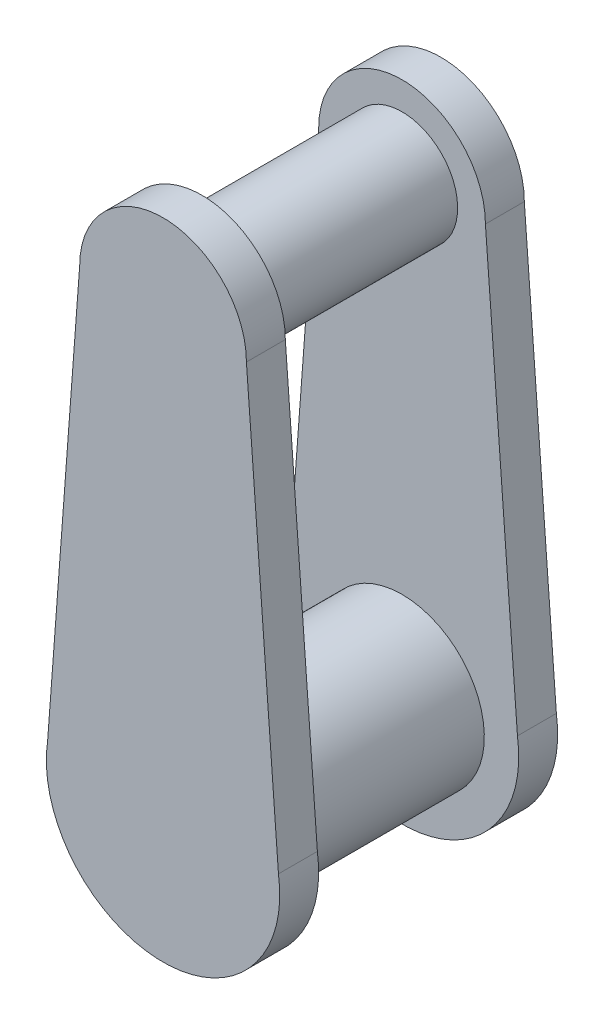
ISO-10303-21;
HEADER;
FILE_DESCRIPTION(('STEP AP214'),'2;1');
FILE_NAME('part.step','',(''),(''),'','','');
FILE_SCHEMA(('AUTOMOTIVE_DESIGN { 1 0 10303 214 1 1 1 1 }'));
ENDSEC;
DATA;
#1=APPLICATION_CONTEXT('core data for automotive mechanical design processes');
#2=APPLICATION_PROTOCOL_DEFINITION('international standard','automotive_design',2000,#1);
#3=PRODUCT_CONTEXT('',#1,'mechanical');
#4=PRODUCT('Part','Part','',(#3));
#5=PRODUCT_RELATED_PRODUCT_CATEGORY('part','',(#4));
#6=PRODUCT_DEFINITION_FORMATION('','',#4);
#7=PRODUCT_DEFINITION_CONTEXT('part definition',#1,'design');
#8=PRODUCT_DEFINITION('design','',#6,#7);
#9=PRODUCT_DEFINITION_SHAPE('','',#8);
#10=(LENGTH_UNIT() NAMED_UNIT(*) SI_UNIT(.MILLI.,.METRE.));
#11=(NAMED_UNIT(*) PLANE_ANGLE_UNIT() SI_UNIT($,.RADIAN.));
#12=(NAMED_UNIT(*) SI_UNIT($,.STERADIAN.) SOLID_ANGLE_UNIT());
#13=UNCERTAINTY_MEASURE_WITH_UNIT(LENGTH_MEASURE(1.E-05),#10,'distance_accuracy_value','');
#14=(GEOMETRIC_REPRESENTATION_CONTEXT(3) GLOBAL_UNCERTAINTY_ASSIGNED_CONTEXT((#13)) GLOBAL_UNIT_ASSIGNED_CONTEXT((#10,
#11,#12)) REPRESENTATION_CONTEXT('',''));
#15=CARTESIAN_POINT('',(0.,0.,0.));
#16=DIRECTION('',(0.,0.,1.));
#17=DIRECTION('',(1.,0.,0.));
#18=AXIS2_PLACEMENT_3D('',#15,#16,#17);
#19=CARTESIAN_POINT('',(0.,-1.41369478928638E-13,-90.));
#20=DIRECTION('',(0.,0.,1.));
#21=DIRECTION('',(0.,-1.,0.));
#22=AXIS2_PLACEMENT_3D('',#19,#20,#21);
#23=CYLINDRICAL_SURFACE('',#22,74.);
#24=CARTESIAN_POINT('',(0.,-1.40630410705256E-13,90.));
#25=DIRECTION('',(0.,0.,1.));
#26=DIRECTION('',(0.,-1.,0.));
#27=AXIS2_PLACEMENT_3D('',#24,#25,#26);
#28=CIRCLE('',#27,74.);
#29=CARTESIAN_POINT('',(0.,74.,90.));
#30=VERTEX_POINT('',#29);
#31=EDGE_CURVE('E206',#30,#30,#28,.T.);
#32=ORIENTED_EDGE('',*,*,#31,.F.);
#33=DIRECTION('',(0.,0.,-1.));
#34=VECTOR('',#33,1.);
#35=CARTESIAN_POINT('',(0.,74.,-90.));
#36=LINE('',#35,#34);
#37=CARTESIAN_POINT('',(0.,74.,-90.));
#38=VERTEX_POINT('',#37);
#39=EDGE_CURVE('E11',#30,#38,#36,.T.);
#40=ORIENTED_EDGE('',*,*,#39,.T.);
#41=CARTESIAN_POINT('',(0.,-1.41369478928638E-13,-90.));
#42=DIRECTION('',(0.,0.,1.));
#43=DIRECTION('',(0.,-1.,0.));
#44=AXIS2_PLACEMENT_3D('',#41,#42,#43);
#45=CIRCLE('',#44,74.);
#46=EDGE_CURVE('E231',#38,#38,#45,.T.);
#47=ORIENTED_EDGE('',*,*,#46,.T.);
#48=ORIENTED_EDGE('',*,*,#39,.F.);
#49=EDGE_LOOP('',(#32,#40,#47,#48));
#50=FACE_BOUND('',#49,.T.);
#51=ADVANCED_FACE('F16',(#50),#23,.T.);
#52=CARTESIAN_POINT('',(0.,-1.40486702995154E-13,125.));
#53=DIRECTION('',(0.,0.,1.));
#54=DIRECTION('',(0.,-1.,0.));
#55=AXIS2_PLACEMENT_3D('',#52,#53,#54);
#56=PLANE('',#55);
#57=CARTESIAN_POINT('',(0.,-1.40486702995154E-13,125.));
#58=DIRECTION('',(0.,0.,1.));
#59=DIRECTION('',(0.,-1.,0.));
#60=AXIS2_PLACEMENT_3D('',#57,#58,#59);
#61=CIRCLE('',#60,105.);
#62=CARTESIAN_POINT('',(-103.825376372133,15.6617757992141,125.));
#63=VERTEX_POINT('',#62);
#64=CARTESIAN_POINT('',(103.825329388074,15.6620872637691,125.));
#65=VERTEX_POINT('',#64);
#66=EDGE_CURVE('E27',#63,#65,#61,.T.);
#67=ORIENTED_EDGE('',*,*,#66,.T.);
#68=DIRECTION('',(-0.0747899119473204,0.997199312610529,0.));
#69=VECTOR('',#68,1.);
#70=CARTESIAN_POINT('',(75.,400.,125.));
#71=LINE('',#70,#69);
#72=CARTESIAN_POINT('',(75.,400.,125.));
#73=VERTEX_POINT('',#72);
#74=EDGE_CURVE('E190',#65,#73,#71,.T.);
#75=ORIENTED_EDGE('',*,*,#74,.T.);
#76=CARTESIAN_POINT('',(0.,400.,125.));
#77=DIRECTION('',(0.,0.,1.));
#78=DIRECTION('',(0.,1.,0.));
#79=AXIS2_PLACEMENT_3D('',#76,#77,#78);
#80=CIRCLE('',#79,75.);
#81=CARTESIAN_POINT('',(-75.,400.,125.));
#82=VERTEX_POINT('',#81);
#83=EDGE_CURVE('E207',#73,#82,#80,.T.);
#84=ORIENTED_EDGE('',*,*,#83,.T.);
#85=DIRECTION('',(-0.074789972899603,-0.997199308039108,0.));
#86=VECTOR('',#85,1.);
#87=CARTESIAN_POINT('',(-75.,400.,125.));
#88=LINE('',#87,#86);
#89=EDGE_CURVE('E198',#82,#63,#88,.T.);
#90=ORIENTED_EDGE('',*,*,#89,.T.);
#91=EDGE_LOOP('',(#67,#75,#84,#90));
#92=FACE_BOUND('',#91,.T.);
#93=ADVANCED_FACE('F237',(#92),#56,.T.);
#94=CARTESIAN_POINT('',(0.,-1.40630410705256E-13,90.));
#95=DIRECTION('',(0.,0.,1.));
#96=DIRECTION('',(0.,-1.,0.));
#97=AXIS2_PLACEMENT_3D('',#94,#95,#96);
#98=CYLINDRICAL_SURFACE('',#97,105.);
#99=DIRECTION('',(0.,0.,-1.));
#100=VECTOR('',#99,1.);
#101=CARTESIAN_POINT('',(-103.825376372133,15.6617757992141,90.));
#102=LINE('',#101,#100);
#103=CARTESIAN_POINT('',(-103.825376372133,15.6617757992141,90.));
#104=VERTEX_POINT('',#103);
#105=EDGE_CURVE('E196',#63,#104,#102,.T.);
#106=ORIENTED_EDGE('',*,*,#105,.T.);
#107=CARTESIAN_POINT('',(0.,-1.40630410705256E-13,90.));
#108=DIRECTION('',(0.,0.,1.));
#109=DIRECTION('',(0.,-1.,0.));
#110=AXIS2_PLACEMENT_3D('',#107,#108,#109);
#111=CIRCLE('',#110,105.);
#112=CARTESIAN_POINT('',(103.825329388074,15.6620872637686,90.));
#113=VERTEX_POINT('',#112);
#114=EDGE_CURVE('E102',#104,#113,#111,.T.);
#115=ORIENTED_EDGE('',*,*,#114,.T.);
#116=DIRECTION('',(0.,0.,1.));
#117=VECTOR('',#116,1.);
#118=CARTESIAN_POINT('',(103.825329388074,15.6620872637686,90.));
#119=LINE('',#118,#117);
#120=EDGE_CURVE('E184',#113,#65,#119,.T.);
#121=ORIENTED_EDGE('',*,*,#120,.T.);
#122=ORIENTED_EDGE('',*,*,#66,.F.);
#123=EDGE_LOOP('',(#106,#115,#121,#122));
#124=FACE_BOUND('',#123,.T.);
#125=ADVANCED_FACE('F245',(#124),#98,.T.);
#126=CARTESIAN_POINT('',(0.,-1.40630410705256E-13,90.));
#127=DIRECTION('',(0.,0.,1.));
#128=DIRECTION('',(0.,-1.,0.));
#129=AXIS2_PLACEMENT_3D('',#126,#127,#128);
#130=PLANE('',#129);
#131=ORIENTED_EDGE('',*,*,#31,.T.);
#132=EDGE_LOOP('',(#131));
#133=FACE_BOUND('',#132,.T.);
#134=CARTESIAN_POINT('',(0.,400.,90.));
#135=DIRECTION('',(0.,0.,1.));
#136=DIRECTION('',(0.,1.,0.));
#137=AXIS2_PLACEMENT_3D('',#134,#135,#136);
#138=CIRCLE('',#137,50.);
#139=CARTESIAN_POINT('',(0.,350.,90.));
#140=VERTEX_POINT('',#139);
#141=EDGE_CURVE('E230',#140,#140,#138,.T.);
#142=ORIENTED_EDGE('',*,*,#141,.T.);
#143=EDGE_LOOP('',(#142));
#144=FACE_BOUND('',#143,.T.);
#145=DIRECTION('',(-0.074789972899603,-0.997199308039108,0.));
#146=VECTOR('',#145,1.);
#147=CARTESIAN_POINT('',(-75.,400.,90.));
#148=LINE('',#147,#146);
#149=CARTESIAN_POINT('',(-75.,400.,90.));
#150=VERTEX_POINT('',#149);
#151=EDGE_CURVE('E214',#150,#104,#148,.T.);
#152=ORIENTED_EDGE('',*,*,#151,.F.);
#153=CARTESIAN_POINT('',(0.,400.,90.));
#154=DIRECTION('',(0.,0.,-1.));
#155=DIRECTION('',(0.,1.,0.));
#156=AXIS2_PLACEMENT_3D('',#153,#154,#155);
#157=CIRCLE('',#156,75.);
#158=CARTESIAN_POINT('',(75.,400.,90.));
#159=VERTEX_POINT('',#158);
#160=EDGE_CURVE('E120',#150,#159,#157,.T.);
#161=ORIENTED_EDGE('',*,*,#160,.T.);
#162=DIRECTION('',(0.0747899119473204,-0.997199312610529,0.));
#163=VECTOR('',#162,1.);
#164=CARTESIAN_POINT('',(75.,400.,90.));
#165=LINE('',#164,#163);
#166=EDGE_CURVE('E191',#159,#113,#165,.T.);
#167=ORIENTED_EDGE('',*,*,#166,.T.);
#168=ORIENTED_EDGE('',*,*,#114,.F.);
#169=EDGE_LOOP('',(#152,#161,#167,#168));
#170=FACE_BOUND('',#169,.T.);
#171=ADVANCED_FACE('F247',(#133,#144,#170),#130,.F.);
#172=CARTESIAN_POINT('',(0.,400.,90.));
#173=DIRECTION('',(0.,0.,1.));
#174=DIRECTION('',(0.,1.,0.));
#175=AXIS2_PLACEMENT_3D('',#172,#173,#174);
#176=CYLINDRICAL_SURFACE('',#175,75.);
#177=ORIENTED_EDGE('',*,*,#160,.F.);
#178=DIRECTION('',(0.,0.,1.));
#179=VECTOR('',#178,1.);
#180=CARTESIAN_POINT('',(-75.,400.,90.));
#181=LINE('',#180,#179);
#182=EDGE_CURVE('E223',#150,#82,#181,.T.);
#183=ORIENTED_EDGE('',*,*,#182,.T.);
#184=ORIENTED_EDGE('',*,*,#83,.F.);
#185=DIRECTION('',(0.,0.,1.));
#186=VECTOR('',#185,1.);
#187=CARTESIAN_POINT('',(75.,400.,90.));
#188=LINE('',#187,#186);
#189=EDGE_CURVE('E186',#159,#73,#188,.T.);
#190=ORIENTED_EDGE('',*,*,#189,.F.);
#191=EDGE_LOOP('',(#177,#183,#184,#190));
#192=FACE_BOUND('',#191,.T.);
#193=ADVANCED_FACE('F242',(#192),#176,.T.);
#194=CARTESIAN_POINT('',(-75.,400.,90.));
#195=DIRECTION('',(-0.997199308039109,0.074789972899603,0.));
#196=DIRECTION('',(0.,0.,1.));
#197=AXIS2_PLACEMENT_3D('',#194,#195,#196);
#198=PLANE('',#197);
#199=ORIENTED_EDGE('',*,*,#105,.F.);
#200=ORIENTED_EDGE('',*,*,#89,.F.);
#201=ORIENTED_EDGE('',*,*,#182,.F.);
#202=ORIENTED_EDGE('',*,*,#151,.T.);
#203=EDGE_LOOP('',(#199,#200,#201,#202));
#204=FACE_BOUND('',#203,.T.);
#205=ADVANCED_FACE('F244',(#204),#198,.T.);
#206=CARTESIAN_POINT('',(103.825344028281,15.6618920609096,90.));
#207=DIRECTION('',(0.997199312610529,0.0747899119473204,0.));
#208=DIRECTION('',(0.,0.,-1.));
#209=AXIS2_PLACEMENT_3D('',#206,#207,#208);
#210=PLANE('',#209);
#211=ORIENTED_EDGE('',*,*,#120,.F.);
#212=ORIENTED_EDGE('',*,*,#166,.F.);
#213=ORIENTED_EDGE('',*,*,#189,.T.);
#214=ORIENTED_EDGE('',*,*,#74,.F.);
#215=EDGE_LOOP('',(#211,#212,#213,#214));
#216=FACE_BOUND('',#215,.T.);
#217=ADVANCED_FACE('F274',(#216),#210,.T.);
#218=CARTESIAN_POINT('',(0.,400.,90.));
#219=DIRECTION('',(0.,0.,-1.));
#220=DIRECTION('',(0.,1.,0.));
#221=AXIS2_PLACEMENT_3D('',#218,#219,#220);
#222=CYLINDRICAL_SURFACE('',#221,50.);
#223=CARTESIAN_POINT('',(0.,400.,-90.));
#224=DIRECTION('',(0.,0.,-1.));
#225=DIRECTION('',(0.,1.,0.));
#226=AXIS2_PLACEMENT_3D('',#223,#224,#225);
#227=CIRCLE('',#226,50.);
#228=CARTESIAN_POINT('',(0.,350.,-90.));
#229=VERTEX_POINT('',#228);
#230=EDGE_CURVE('E161',#229,#229,#227,.T.);
#231=ORIENTED_EDGE('',*,*,#230,.F.);
#232=DIRECTION('',(0.,0.,1.));
#233=VECTOR('',#232,1.);
#234=CARTESIAN_POINT('',(0.,350.,90.));
#235=LINE('',#234,#233);
#236=EDGE_CURVE('E145',#229,#140,#235,.T.);
#237=ORIENTED_EDGE('',*,*,#236,.T.);
#238=ORIENTED_EDGE('',*,*,#141,.F.);
#239=ORIENTED_EDGE('',*,*,#236,.F.);
#240=EDGE_LOOP('',(#231,#237,#238,#239));
#241=FACE_BOUND('',#240,.T.);
#242=ADVANCED_FACE('F271',(#241),#222,.T.);
#243=CARTESIAN_POINT('',(0.,-1.41369478928638E-13,-90.));
#244=DIRECTION('',(0.,0.,1.));
#245=DIRECTION('',(0.,-1.,0.));
#246=AXIS2_PLACEMENT_3D('',#243,#244,#245);
#247=CYLINDRICAL_SURFACE('',#246,105.);
#248=DIRECTION('',(0.,0.,-1.));
#249=VECTOR('',#248,1.);
#250=CARTESIAN_POINT('',(-103.825376372133,15.6617757992141,-90.));
#251=LINE('',#250,#249);
#252=CARTESIAN_POINT('',(-103.825376372133,15.6617757992141,-90.));
#253=VERTEX_POINT('',#252);
#254=CARTESIAN_POINT('',(-103.825376372133,15.6617757992141,-125.));
#255=VERTEX_POINT('',#254);
#256=EDGE_CURVE('E195',#253,#255,#251,.T.);
#257=ORIENTED_EDGE('',*,*,#256,.T.);
#258=CARTESIAN_POINT('',(0.,-1.4151318663874E-13,-125.));
#259=DIRECTION('',(0.,0.,1.));
#260=DIRECTION('',(0.,-1.,0.));
#261=AXIS2_PLACEMENT_3D('',#258,#259,#260);
#262=CIRCLE('',#261,105.);
#263=CARTESIAN_POINT('',(103.825329388074,15.6620872637691,-125.));
#264=VERTEX_POINT('',#263);
#265=EDGE_CURVE('E75',#255,#264,#262,.T.);
#266=ORIENTED_EDGE('',*,*,#265,.T.);
#267=DIRECTION('',(0.,0.,1.));
#268=VECTOR('',#267,1.);
#269=CARTESIAN_POINT('',(103.825329388074,15.6620872637686,-90.));
#270=LINE('',#269,#268);
#271=CARTESIAN_POINT('',(103.825329388074,15.6620872637686,-90.));
#272=VERTEX_POINT('',#271);
#273=EDGE_CURVE('E165',#264,#272,#270,.T.);
#274=ORIENTED_EDGE('',*,*,#273,.T.);
#275=CARTESIAN_POINT('',(0.,-1.41369478928638E-13,-90.));
#276=DIRECTION('',(0.,0.,1.));
#277=DIRECTION('',(0.,-1.,0.));
#278=AXIS2_PLACEMENT_3D('',#275,#276,#277);
#279=CIRCLE('',#278,105.);
#280=EDGE_CURVE('E20',#253,#272,#279,.T.);
#281=ORIENTED_EDGE('',*,*,#280,.F.);
#282=EDGE_LOOP('',(#257,#266,#274,#281));
#283=FACE_BOUND('',#282,.T.);
#284=ADVANCED_FACE('F171',(#283),#247,.T.);
#285=CARTESIAN_POINT('',(0.,-1.41369478928638E-13,-90.));
#286=DIRECTION('',(0.,0.,1.));
#287=DIRECTION('',(0.,-1.,0.));
#288=AXIS2_PLACEMENT_3D('',#285,#286,#287);
#289=PLANE('',#288);
#290=ORIENTED_EDGE('',*,*,#46,.F.);
#291=EDGE_LOOP('',(#290));
#292=FACE_BOUND('',#291,.T.);
#293=ORIENTED_EDGE('',*,*,#230,.T.);
#294=EDGE_LOOP('',(#293));
#295=FACE_BOUND('',#294,.T.);
#296=ORIENTED_EDGE('',*,*,#280,.T.);
#297=DIRECTION('',(0.0747899119473204,-0.997199312610529,0.));
#298=VECTOR('',#297,1.);
#299=CARTESIAN_POINT('',(75.,400.,-90.));
#300=LINE('',#299,#298);
#301=CARTESIAN_POINT('',(75.,400.,-90.));
#302=VERTEX_POINT('',#301);
#303=EDGE_CURVE('E152',#302,#272,#300,.T.);
#304=ORIENTED_EDGE('',*,*,#303,.F.);
#305=CARTESIAN_POINT('',(0.,400.,-90.));
#306=DIRECTION('',(0.,0.,-1.));
#307=DIRECTION('',(0.,1.,0.));
#308=AXIS2_PLACEMENT_3D('',#305,#306,#307);
#309=CIRCLE('',#308,75.);
#310=CARTESIAN_POINT('',(-75.,400.,-90.));
#311=VERTEX_POINT('',#310);
#312=EDGE_CURVE('E58',#311,#302,#309,.T.);
#313=ORIENTED_EDGE('',*,*,#312,.F.);
#314=DIRECTION('',(-0.074789972899603,-0.997199308039108,0.));
#315=VECTOR('',#314,1.);
#316=CARTESIAN_POINT('',(-75.,400.,-90.));
#317=LINE('',#316,#315);
#318=EDGE_CURVE('E155',#311,#253,#317,.T.);
#319=ORIENTED_EDGE('',*,*,#318,.T.);
#320=EDGE_LOOP('',(#296,#304,#313,#319));
#321=FACE_BOUND('',#320,.T.);
#322=ADVANCED_FACE('F151',(#292,#295,#321),#289,.T.);
#323=CARTESIAN_POINT('',(0.,-1.4151318663874E-13,-125.));
#324=DIRECTION('',(0.,0.,1.));
#325=DIRECTION('',(0.,-1.,0.));
#326=AXIS2_PLACEMENT_3D('',#323,#324,#325);
#327=PLANE('',#326);
#328=DIRECTION('',(-0.074789972899603,-0.997199308039108,0.));
#329=VECTOR('',#328,1.);
#330=CARTESIAN_POINT('',(-75.,400.,-125.));
#331=LINE('',#330,#329);
#332=CARTESIAN_POINT('',(-75.,400.,-125.));
#333=VERTEX_POINT('',#332);
#334=EDGE_CURVE('E203',#333,#255,#331,.T.);
#335=ORIENTED_EDGE('',*,*,#334,.F.);
#336=CARTESIAN_POINT('',(0.,400.,-125.));
#337=DIRECTION('',(0.,0.,1.));
#338=DIRECTION('',(0.,1.,0.));
#339=AXIS2_PLACEMENT_3D('',#336,#337,#338);
#340=CIRCLE('',#339,75.);
#341=CARTESIAN_POINT('',(75.,400.,-125.));
#342=VERTEX_POINT('',#341);
#343=EDGE_CURVE('E173',#342,#333,#340,.T.);
#344=ORIENTED_EDGE('',*,*,#343,.F.);
#345=DIRECTION('',(-0.0747899119473204,0.997199312610529,0.));
#346=VECTOR('',#345,1.);
#347=CARTESIAN_POINT('',(75.,400.,-125.));
#348=LINE('',#347,#346);
#349=EDGE_CURVE('E169',#264,#342,#348,.T.);
#350=ORIENTED_EDGE('',*,*,#349,.F.);
#351=ORIENTED_EDGE('',*,*,#265,.F.);
#352=EDGE_LOOP('',(#335,#344,#350,#351));
#353=FACE_BOUND('',#352,.T.);
#354=ADVANCED_FACE('F264',(#353),#327,.F.);
#355=CARTESIAN_POINT('',(103.825344028281,15.6618920609096,-90.));
#356=DIRECTION('',(-0.997199312610529,-0.0747899119473204,0.));
#357=DIRECTION('',(-0.0747899119473204,0.997199312610529,0.));
#358=AXIS2_PLACEMENT_3D('',#355,#356,#357);
#359=PLANE('',#358);
#360=ORIENTED_EDGE('',*,*,#273,.F.);
#361=ORIENTED_EDGE('',*,*,#349,.T.);
#362=DIRECTION('',(0.,0.,-1.));
#363=VECTOR('',#362,1.);
#364=CARTESIAN_POINT('',(75.,400.,-90.));
#365=LINE('',#364,#363);
#366=EDGE_CURVE('E167',#302,#342,#365,.T.);
#367=ORIENTED_EDGE('',*,*,#366,.F.);
#368=ORIENTED_EDGE('',*,*,#303,.T.);
#369=EDGE_LOOP('',(#360,#361,#367,#368));
#370=FACE_BOUND('',#369,.T.);
#371=ADVANCED_FACE('F164',(#370),#359,.F.);
#372=CARTESIAN_POINT('',(0.,400.,-90.));
#373=DIRECTION('',(0.,0.,1.));
#374=DIRECTION('',(0.,1.,0.));
#375=AXIS2_PLACEMENT_3D('',#372,#373,#374);
#376=CYLINDRICAL_SURFACE('',#375,75.);
#377=ORIENTED_EDGE('',*,*,#312,.T.);
#378=ORIENTED_EDGE('',*,*,#366,.T.);
#379=ORIENTED_EDGE('',*,*,#343,.T.);
#380=DIRECTION('',(0.,0.,-1.));
#381=VECTOR('',#380,1.);
#382=CARTESIAN_POINT('',(-75.,400.,-90.));
#383=LINE('',#382,#381);
#384=EDGE_CURVE('E194',#311,#333,#383,.T.);
#385=ORIENTED_EDGE('',*,*,#384,.F.);
#386=EDGE_LOOP('',(#377,#378,#379,#385));
#387=FACE_BOUND('',#386,.T.);
#388=ADVANCED_FACE('F18',(#387),#376,.T.);
#389=CARTESIAN_POINT('',(-75.,400.,-90.));
#390=DIRECTION('',(0.997199308039109,-0.074789972899603,0.));
#391=DIRECTION('',(0.,0.,-1.));
#392=AXIS2_PLACEMENT_3D('',#389,#390,#391);
#393=PLANE('',#392);
#394=ORIENTED_EDGE('',*,*,#256,.F.);
#395=ORIENTED_EDGE('',*,*,#318,.F.);
#396=ORIENTED_EDGE('',*,*,#384,.T.);
#397=ORIENTED_EDGE('',*,*,#334,.T.);
#398=EDGE_LOOP('',(#394,#395,#396,#397));
#399=FACE_BOUND('',#398,.T.);
#400=ADVANCED_FACE('F265',(#399),#393,.F.);
#401=CLOSED_SHELL('',(#51,#93,#125,#171,#193,#205,#217,#242,#284,#322,#354,#371,#388,#400));
#402=MANIFOLD_SOLID_BREP('B1',#401);
#403=ADVANCED_BREP_SHAPE_REPRESENTATION('',(#18,#402),#14);
#404=SHAPE_DEFINITION_REPRESENTATION(#9,#403);
ENDSEC;
END-ISO-10303-21;
